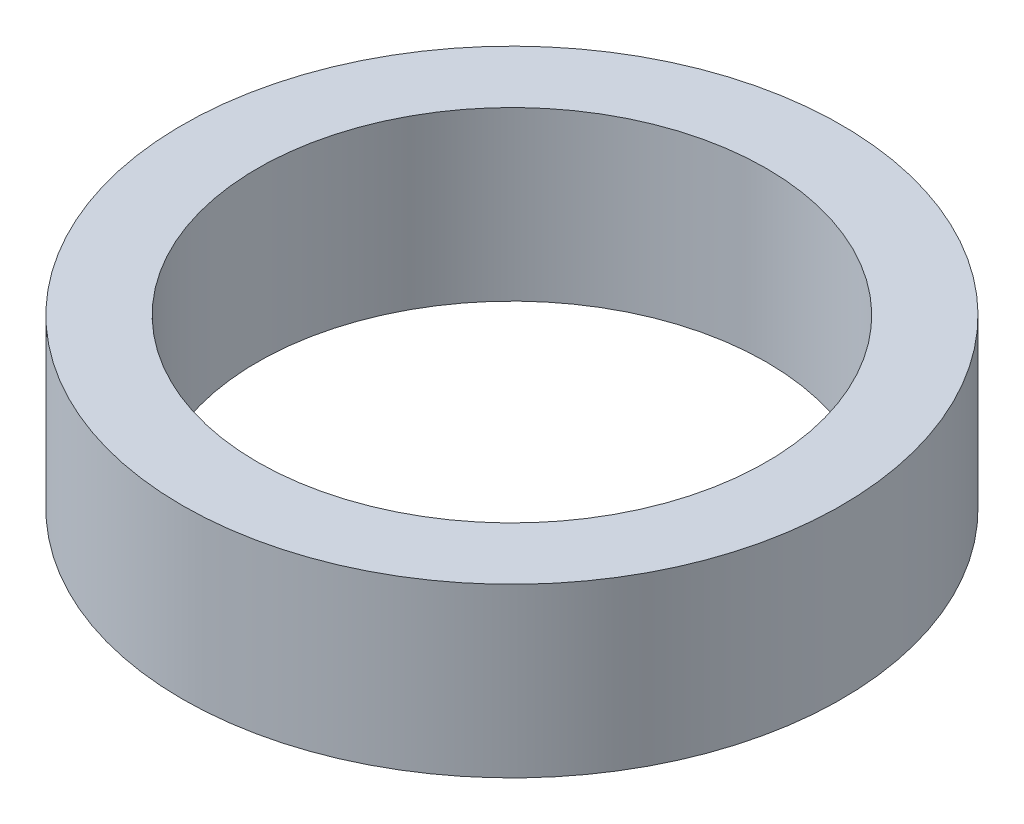
ISO-10303-21;
HEADER;
FILE_DESCRIPTION(('STEP AP214'),'2;1');
FILE_NAME('part.step','',(''),(''),'','','');
FILE_SCHEMA(('AUTOMOTIVE_DESIGN { 1 0 10303 214 1 1 1 1 }'));
ENDSEC;
DATA;
#1=APPLICATION_CONTEXT('core data for automotive mechanical design processes');
#2=APPLICATION_PROTOCOL_DEFINITION('international standard','automotive_design',2000,#1);
#3=PRODUCT_CONTEXT('',#1,'mechanical');
#4=PRODUCT('Part','Part','',(#3));
#5=PRODUCT_RELATED_PRODUCT_CATEGORY('part','',(#4));
#6=PRODUCT_DEFINITION_FORMATION('','',#4);
#7=PRODUCT_DEFINITION_CONTEXT('part definition',#1,'design');
#8=PRODUCT_DEFINITION('design','',#6,#7);
#9=PRODUCT_DEFINITION_SHAPE('','',#8);
#10=(LENGTH_UNIT() NAMED_UNIT(*) SI_UNIT(.MILLI.,.METRE.));
#11=(NAMED_UNIT(*) PLANE_ANGLE_UNIT() SI_UNIT($,.RADIAN.));
#12=(NAMED_UNIT(*) SI_UNIT($,.STERADIAN.) SOLID_ANGLE_UNIT());
#13=UNCERTAINTY_MEASURE_WITH_UNIT(LENGTH_MEASURE(1.E-05),#10,'distance_accuracy_value','');
#14=(GEOMETRIC_REPRESENTATION_CONTEXT(3) GLOBAL_UNCERTAINTY_ASSIGNED_CONTEXT((#13)) GLOBAL_UNIT_ASSIGNED_CONTEXT((#10,
#11,#12)) REPRESENTATION_CONTEXT('',''));
#15=CARTESIAN_POINT('',(0.,0.,0.));
#16=DIRECTION('',(0.,0.,1.));
#17=DIRECTION('',(1.,0.,0.));
#18=AXIS2_PLACEMENT_3D('',#15,#16,#17);
#19=CARTESIAN_POINT('',(0.,14.5,0.));
#20=DIRECTION('',(0.,1.,0.));
#21=DIRECTION('',(0.,0.,1.));
#22=AXIS2_PLACEMENT_3D('',#19,#20,#21);
#23=PLANE('',#22);
#24=CARTESIAN_POINT('',(0.,14.5,0.));
#25=DIRECTION('',(0.,1.,0.));
#26=DIRECTION('',(0.,0.,1.));
#27=AXIS2_PLACEMENT_3D('',#24,#25,#26);
#28=CIRCLE('',#27,28.5);
#29=CARTESIAN_POINT('',(0.,14.5,28.5));
#30=VERTEX_POINT('',#29);
#31=EDGE_CURVE('E10',#30,#30,#28,.T.);
#32=ORIENTED_EDGE('',*,*,#31,.T.);
#33=EDGE_LOOP('',(#32));
#34=FACE_BOUND('',#33,.T.);
#35=CARTESIAN_POINT('',(0.,14.5,0.));
#36=DIRECTION('',(0.,1.,0.));
#37=DIRECTION('',(0.,0.,1.));
#38=AXIS2_PLACEMENT_3D('',#35,#36,#37);
#39=CIRCLE('',#38,22.);
#40=CARTESIAN_POINT('',(0.,14.5,22.));
#41=VERTEX_POINT('',#40);
#42=EDGE_CURVE('E50',#41,#41,#39,.T.);
#43=ORIENTED_EDGE('',*,*,#42,.F.);
#44=EDGE_LOOP('',(#43));
#45=FACE_BOUND('',#44,.T.);
#46=ADVANCED_FACE('F37',(#34,#45),#23,.T.);
#47=CARTESIAN_POINT('',(0.,0.,0.));
#48=DIRECTION('',(0.,1.,0.));
#49=DIRECTION('',(0.,0.,1.));
#50=AXIS2_PLACEMENT_3D('',#47,#48,#49);
#51=PLANE('',#50);
#52=CARTESIAN_POINT('',(0.,0.,0.));
#53=DIRECTION('',(0.,1.,0.));
#54=DIRECTION('',(0.,0.,1.));
#55=AXIS2_PLACEMENT_3D('',#52,#53,#54);
#56=CIRCLE('',#55,28.5);
#57=CARTESIAN_POINT('',(0.,0.,28.5));
#58=VERTEX_POINT('',#57);
#59=EDGE_CURVE('E41',#58,#58,#56,.T.);
#60=ORIENTED_EDGE('',*,*,#59,.F.);
#61=EDGE_LOOP('',(#60));
#62=FACE_BOUND('',#61,.T.);
#63=CARTESIAN_POINT('',(0.,0.,0.));
#64=DIRECTION('',(0.,1.,0.));
#65=DIRECTION('',(0.,0.,1.));
#66=AXIS2_PLACEMENT_3D('',#63,#64,#65);
#67=CIRCLE('',#66,22.);
#68=CARTESIAN_POINT('',(0.,0.,22.));
#69=VERTEX_POINT('',#68);
#70=EDGE_CURVE('E52',#69,#69,#67,.T.);
#71=ORIENTED_EDGE('',*,*,#70,.T.);
#72=EDGE_LOOP('',(#71));
#73=FACE_BOUND('',#72,.T.);
#74=ADVANCED_FACE('F64',(#62,#73),#51,.F.);
#75=CARTESIAN_POINT('',(0.,14.5,0.));
#76=DIRECTION('',(0.,-1.,0.));
#77=DIRECTION('',(0.,0.,-1.));
#78=AXIS2_PLACEMENT_3D('',#75,#76,#77);
#79=CYLINDRICAL_SURFACE('',#78,28.5);
#80=ORIENTED_EDGE('',*,*,#31,.F.);
#81=EDGE_LOOP('',(#80));
#82=FACE_BOUND('',#81,.T.);
#83=ORIENTED_EDGE('',*,*,#59,.T.);
#84=EDGE_LOOP('',(#83));
#85=FACE_BOUND('',#84,.T.);
#86=ADVANCED_FACE('F39',(#82,#85),#79,.T.);
#87=CARTESIAN_POINT('',(0.,14.5,0.));
#88=DIRECTION('',(0.,-1.,0.));
#89=DIRECTION('',(0.,0.,-1.));
#90=AXIS2_PLACEMENT_3D('',#87,#88,#89);
#91=CYLINDRICAL_SURFACE('',#90,22.);
#92=ORIENTED_EDGE('',*,*,#42,.T.);
#93=EDGE_LOOP('',(#92));
#94=FACE_BOUND('',#93,.T.);
#95=ORIENTED_EDGE('',*,*,#70,.F.);
#96=EDGE_LOOP('',(#95));
#97=FACE_BOUND('',#96,.T.);
#98=ADVANCED_FACE('F60',(#94,#97),#91,.F.);
#99=CLOSED_SHELL('',(#46,#74,#86,#98));
#100=MANIFOLD_SOLID_BREP('B2',#99);
#101=ADVANCED_BREP_SHAPE_REPRESENTATION('',(#18,#100),#14);
#102=SHAPE_DEFINITION_REPRESENTATION(#9,#101);
ENDSEC;
END-ISO-10303-21;
